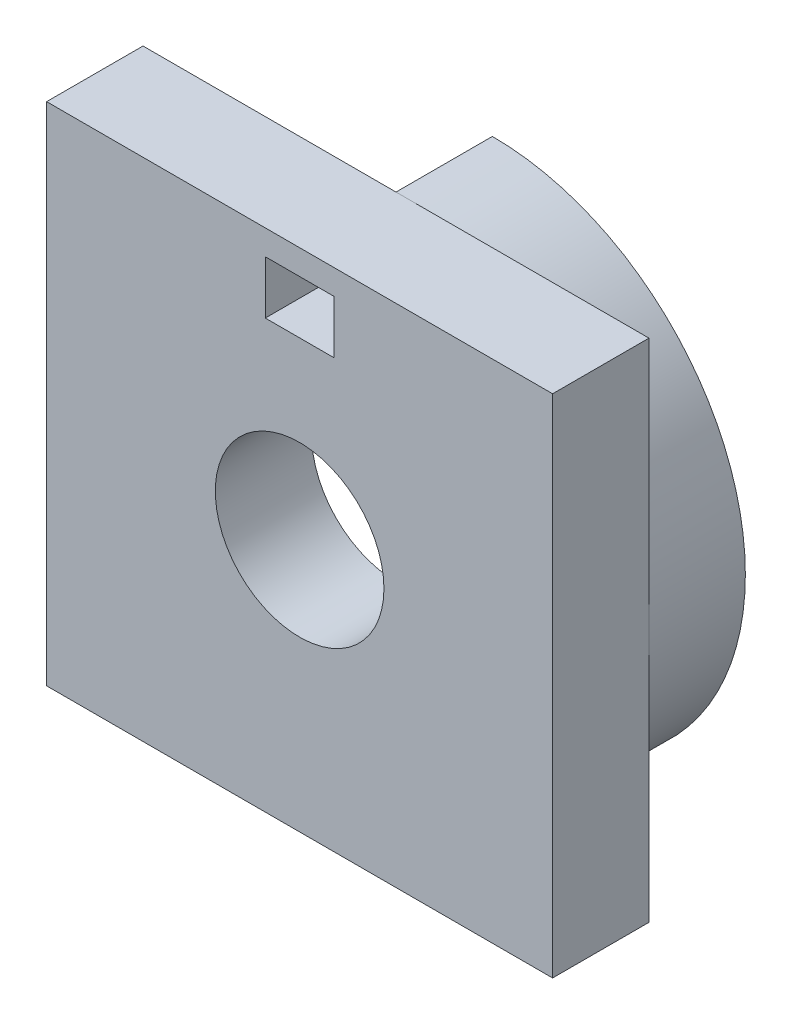
ISO-10303-21;
HEADER;
FILE_DESCRIPTION(('STEP AP214'),'2;1');
FILE_NAME('part.step','',(''),(''),'','','');
FILE_SCHEMA(('AUTOMOTIVE_DESIGN { 1 0 10303 214 1 1 1 1 }'));
ENDSEC;
DATA;
#1=APPLICATION_CONTEXT('core data for automotive mechanical design processes');
#2=APPLICATION_PROTOCOL_DEFINITION('international standard','automotive_design',2000,#1);
#3=PRODUCT_CONTEXT('',#1,'mechanical');
#4=PRODUCT('Part','Part','',(#3));
#5=PRODUCT_RELATED_PRODUCT_CATEGORY('part','',(#4));
#6=PRODUCT_DEFINITION_FORMATION('','',#4);
#7=PRODUCT_DEFINITION_CONTEXT('part definition',#1,'design');
#8=PRODUCT_DEFINITION('design','',#6,#7);
#9=PRODUCT_DEFINITION_SHAPE('','',#8);
#10=(LENGTH_UNIT() NAMED_UNIT(*) SI_UNIT(.MILLI.,.METRE.));
#11=(NAMED_UNIT(*) PLANE_ANGLE_UNIT() SI_UNIT($,.RADIAN.));
#12=(NAMED_UNIT(*) SI_UNIT($,.STERADIAN.) SOLID_ANGLE_UNIT());
#13=UNCERTAINTY_MEASURE_WITH_UNIT(LENGTH_MEASURE(1.E-05),#10,'distance_accuracy_value','');
#14=(GEOMETRIC_REPRESENTATION_CONTEXT(3) GLOBAL_UNCERTAINTY_ASSIGNED_CONTEXT((#13)) GLOBAL_UNIT_ASSIGNED_CONTEXT((#10,
#11,#12)) REPRESENTATION_CONTEXT('',''));
#15=CARTESIAN_POINT('',(0.,0.,0.));
#16=DIRECTION('',(0.,0.,1.));
#17=DIRECTION('',(1.,0.,0.));
#18=AXIS2_PLACEMENT_3D('',#15,#16,#17);
#19=CARTESIAN_POINT('',(0.,0.,0.));
#20=DIRECTION('',(0.,0.,1.));
#21=DIRECTION('',(1.,0.,0.));
#22=AXIS2_PLACEMENT_3D('',#19,#20,#21);
#23=PLANE('',#22);
#24=CARTESIAN_POINT('',(0.,0.,0.));
#25=DIRECTION('',(0.,0.,1.));
#26=DIRECTION('',(1.,0.,0.));
#27=AXIS2_PLACEMENT_3D('',#24,#25,#26);
#28=CIRCLE('',#27,3.5);
#29=CARTESIAN_POINT('',(3.5,0.,0.));
#30=VERTEX_POINT('',#29);
#31=EDGE_CURVE('E242',#30,#30,#28,.T.);
#32=ORIENTED_EDGE('',*,*,#31,.T.);
#33=EDGE_LOOP('',(#32));
#34=FACE_BOUND('',#33,.T.);
#35=DIRECTION('',(-1.,0.,0.));
#36=VECTOR('',#35,1.);
#37=CARTESIAN_POINT('',(1.425,7.2584031040867,0.));
#38=LINE('',#37,#36);
#39=CARTESIAN_POINT('',(1.425,7.2584031040867,0.));
#40=VERTEX_POINT('',#39);
#41=CARTESIAN_POINT('',(-1.425,7.25840310408671,0.));
#42=VERTEX_POINT('',#41);
#43=EDGE_CURVE('E179',#40,#42,#38,.T.);
#44=ORIENTED_EDGE('',*,*,#43,.F.);
#45=DIRECTION('',(0.,-1.,0.));
#46=VECTOR('',#45,1.);
#47=CARTESIAN_POINT('',(1.42499999999999,9.46381623713399,0.));
#48=LINE('',#47,#46);
#49=CARTESIAN_POINT('',(1.425,8.88647145947141,0.));
#50=VERTEX_POINT('',#49);
#51=EDGE_CURVE('E149',#50,#40,#48,.T.);
#52=ORIENTED_EDGE('',*,*,#51,.F.);
#53=CARTESIAN_POINT('',(0.,0.,0.));
#54=DIRECTION('',(0.,0.,1.));
#55=DIRECTION('',(-1.,0.,0.));
#56=AXIS2_PLACEMENT_3D('',#53,#54,#55);
#57=CIRCLE('',#56,9.);
#58=CARTESIAN_POINT('',(0.,-9.,0.));
#59=VERTEX_POINT('',#58);
#60=EDGE_CURVE('E198',#59,#50,#57,.T.);
#61=ORIENTED_EDGE('',*,*,#60,.F.);
#62=DIRECTION('',(0.,1.,0.));
#63=VECTOR('',#62,1.);
#64=CARTESIAN_POINT('',(0.,-9.,0.));
#65=LINE('',#64,#63);
#66=CARTESIAN_POINT('',(0.,-10.5,0.));
#67=VERTEX_POINT('',#66);
#68=EDGE_CURVE('E204',#67,#59,#65,.T.);
#69=ORIENTED_EDGE('',*,*,#68,.F.);
#70=DIRECTION('',(1.,0.,0.));
#71=VECTOR('',#70,1.);
#72=CARTESIAN_POINT('',(-10.5,-10.5,0.));
#73=LINE('',#72,#71);
#74=CARTESIAN_POINT('',(-10.5,-10.5,0.));
#75=VERTEX_POINT('',#74);
#76=EDGE_CURVE('E256',#75,#67,#73,.T.);
#77=ORIENTED_EDGE('',*,*,#76,.F.);
#78=DIRECTION('',(0.,-1.,0.));
#79=VECTOR('',#78,1.);
#80=CARTESIAN_POINT('',(-10.5,10.5,0.));
#81=LINE('',#80,#79);
#82=CARTESIAN_POINT('',(-10.5,10.5,0.));
#83=VERTEX_POINT('',#82);
#84=EDGE_CURVE('E275',#83,#75,#81,.T.);
#85=ORIENTED_EDGE('',*,*,#84,.F.);
#86=DIRECTION('',(-1.,0.,0.));
#87=VECTOR('',#86,1.);
#88=CARTESIAN_POINT('',(-10.5,10.5,0.));
#89=LINE('',#88,#87);
#90=CARTESIAN_POINT('',(0.,10.5,0.));
#91=VERTEX_POINT('',#90);
#92=EDGE_CURVE('E270',#91,#83,#89,.T.);
#93=ORIENTED_EDGE('',*,*,#92,.F.);
#94=DIRECTION('',(0.,1.,0.));
#95=VECTOR('',#94,1.);
#96=CARTESIAN_POINT('',(0.,10.5,0.));
#97=LINE('',#96,#95);
#98=CARTESIAN_POINT('',(0.,9.46381623713399,0.));
#99=VERTEX_POINT('',#98);
#100=EDGE_CURVE('E217',#99,#91,#97,.T.);
#101=ORIENTED_EDGE('',*,*,#100,.F.);
#102=DIRECTION('',(1.,0.,0.));
#103=VECTOR('',#102,1.);
#104=CARTESIAN_POINT('',(1.42499999999999,9.46381623713399,0.));
#105=LINE('',#104,#103);
#106=CARTESIAN_POINT('',(-1.42500000000001,9.46381623713399,0.));
#107=VERTEX_POINT('',#106);
#108=EDGE_CURVE('E65',#107,#99,#105,.T.);
#109=ORIENTED_EDGE('',*,*,#108,.F.);
#110=DIRECTION('',(0.,1.,0.));
#111=VECTOR('',#110,1.);
#112=CARTESIAN_POINT('',(-1.42500000000001,9.46381623713399,0.));
#113=LINE('',#112,#111);
#114=EDGE_CURVE('E182',#42,#107,#113,.T.);
#115=ORIENTED_EDGE('',*,*,#114,.F.);
#116=EDGE_LOOP('',(#44,#52,#61,#69,#77,#85,#93,#101,#109,#115));
#117=FACE_BOUND('',#116,.T.);
#118=ADVANCED_FACE('F39',(#34,#117),#23,.F.);
#119=CARTESIAN_POINT('',(0.,0.,0.));
#120=DIRECTION('',(0.,0.,-1.));
#121=DIRECTION('',(-1.,0.,0.));
#122=AXIS2_PLACEMENT_3D('',#119,#120,#121);
#123=CIRCLE('',#122,10.5);
#124=CARTESIAN_POINT('',(10.5,0.,0.));
#125=VERTEX_POINT('',#124);
#126=EDGE_CURVE('E11',#125,#67,#123,.T.);
#127=ORIENTED_EDGE('',*,*,#126,.F.);
#128=DIRECTION('',(0.,1.,0.));
#129=VECTOR('',#128,1.);
#130=CARTESIAN_POINT('',(10.5,10.5,0.));
#131=LINE('',#130,#129);
#132=CARTESIAN_POINT('',(10.5,-10.5,0.));
#133=VERTEX_POINT('',#132);
#134=EDGE_CURVE('E266',#133,#125,#131,.T.);
#135=ORIENTED_EDGE('',*,*,#134,.F.);
#136=EDGE_CURVE('E278',#67,#133,#73,.T.);
#137=ORIENTED_EDGE('',*,*,#136,.F.);
#138=EDGE_LOOP('',(#127,#135,#137));
#139=FACE_BOUND('',#138,.T.);
#140=ADVANCED_FACE('F329',(#139),#23,.F.);
#141=EDGE_CURVE('E50',#91,#125,#123,.T.);
#142=ORIENTED_EDGE('',*,*,#141,.F.);
#143=CARTESIAN_POINT('',(10.5,10.5,0.));
#144=VERTEX_POINT('',#143);
#145=EDGE_CURVE('E271',#144,#91,#89,.T.);
#146=ORIENTED_EDGE('',*,*,#145,.F.);
#147=EDGE_CURVE('E247',#125,#144,#131,.T.);
#148=ORIENTED_EDGE('',*,*,#147,.F.);
#149=EDGE_LOOP('',(#142,#146,#148));
#150=FACE_BOUND('',#149,.T.);
#151=ADVANCED_FACE('F309',(#150),#23,.F.);
#152=CARTESIAN_POINT('',(0.,0.,4.));
#153=DIRECTION('',(0.,0.,1.));
#154=DIRECTION('',(1.,0.,0.));
#155=AXIS2_PLACEMENT_3D('',#152,#153,#154);
#156=PLANE('',#155);
#157=DIRECTION('',(0.,-1.,0.));
#158=VECTOR('',#157,1.);
#159=CARTESIAN_POINT('',(1.42499999999999,9.46381623713399,4.));
#160=LINE('',#159,#158);
#161=CARTESIAN_POINT('',(1.42499999999999,9.46381623713399,4.));
#162=VERTEX_POINT('',#161);
#163=CARTESIAN_POINT('',(1.425,7.2584031040867,4.));
#164=VERTEX_POINT('',#163);
#165=EDGE_CURVE('E146',#162,#164,#160,.T.);
#166=ORIENTED_EDGE('',*,*,#165,.T.);
#167=DIRECTION('',(-1.,0.,0.));
#168=VECTOR('',#167,1.);
#169=CARTESIAN_POINT('',(1.425,7.2584031040867,4.));
#170=LINE('',#169,#168);
#171=CARTESIAN_POINT('',(-1.425,7.25840310408671,4.));
#172=VERTEX_POINT('',#171);
#173=EDGE_CURVE('E158',#164,#172,#170,.T.);
#174=ORIENTED_EDGE('',*,*,#173,.T.);
#175=DIRECTION('',(0.,1.,0.));
#176=VECTOR('',#175,1.);
#177=CARTESIAN_POINT('',(-1.42500000000001,9.46381623713399,4.));
#178=LINE('',#177,#176);
#179=CARTESIAN_POINT('',(-1.42500000000001,9.46381623713399,4.));
#180=VERTEX_POINT('',#179);
#181=EDGE_CURVE('E57',#172,#180,#178,.T.);
#182=ORIENTED_EDGE('',*,*,#181,.T.);
#183=DIRECTION('',(1.,0.,0.));
#184=VECTOR('',#183,1.);
#185=CARTESIAN_POINT('',(1.42499999999999,9.46381623713399,4.));
#186=LINE('',#185,#184);
#187=EDGE_CURVE('E155',#180,#162,#186,.T.);
#188=ORIENTED_EDGE('',*,*,#187,.T.);
#189=EDGE_LOOP('',(#166,#174,#182,#188));
#190=FACE_BOUND('',#189,.T.);
#191=DIRECTION('',(0.,1.,0.));
#192=VECTOR('',#191,1.);
#193=CARTESIAN_POINT('',(10.5,10.5,4.));
#194=LINE('',#193,#192);
#195=CARTESIAN_POINT('',(10.5,-10.5,4.));
#196=VERTEX_POINT('',#195);
#197=CARTESIAN_POINT('',(10.5,10.5,4.));
#198=VERTEX_POINT('',#197);
#199=EDGE_CURVE('E251',#196,#198,#194,.T.);
#200=ORIENTED_EDGE('',*,*,#199,.T.);
#201=DIRECTION('',(-1.,0.,0.));
#202=VECTOR('',#201,1.);
#203=CARTESIAN_POINT('',(-10.5,10.5,4.));
#204=LINE('',#203,#202);
#205=CARTESIAN_POINT('',(-10.5,10.5,4.));
#206=VERTEX_POINT('',#205);
#207=EDGE_CURVE('E255',#198,#206,#204,.T.);
#208=ORIENTED_EDGE('',*,*,#207,.T.);
#209=DIRECTION('',(0.,-1.,0.));
#210=VECTOR('',#209,1.);
#211=CARTESIAN_POINT('',(-10.5,10.5,4.));
#212=LINE('',#211,#210);
#213=CARTESIAN_POINT('',(-10.5,-10.5,4.));
#214=VERTEX_POINT('',#213);
#215=EDGE_CURVE('E259',#206,#214,#212,.T.);
#216=ORIENTED_EDGE('',*,*,#215,.T.);
#217=DIRECTION('',(1.,0.,0.));
#218=VECTOR('',#217,1.);
#219=CARTESIAN_POINT('',(-10.5,-10.5,4.));
#220=LINE('',#219,#218);
#221=EDGE_CURVE('E262',#214,#196,#220,.T.);
#222=ORIENTED_EDGE('',*,*,#221,.T.);
#223=EDGE_LOOP('',(#200,#208,#216,#222));
#224=FACE_BOUND('',#223,.T.);
#225=CARTESIAN_POINT('',(0.,0.,4.));
#226=DIRECTION('',(0.,0.,1.));
#227=DIRECTION('',(1.,0.,0.));
#228=AXIS2_PLACEMENT_3D('',#225,#226,#227);
#229=CIRCLE('',#228,3.5);
#230=CARTESIAN_POINT('',(3.5,0.,4.));
#231=VERTEX_POINT('',#230);
#232=EDGE_CURVE('E243',#231,#231,#229,.T.);
#233=ORIENTED_EDGE('',*,*,#232,.F.);
#234=EDGE_LOOP('',(#233));
#235=FACE_BOUND('',#234,.T.);
#236=ADVANCED_FACE('F163',(#190,#224,#235),#156,.T.);
#237=CARTESIAN_POINT('',(10.5,10.5,4.));
#238=DIRECTION('',(-1.,0.,0.));
#239=DIRECTION('',(0.,0.,1.));
#240=AXIS2_PLACEMENT_3D('',#237,#238,#239);
#241=PLANE('',#240);
#242=ORIENTED_EDGE('',*,*,#134,.T.);
#243=ORIENTED_EDGE('',*,*,#147,.T.);
#244=DIRECTION('',(0.,0.,-1.));
#245=VECTOR('',#244,1.);
#246=CARTESIAN_POINT('',(10.5,10.5,4.));
#247=LINE('',#246,#245);
#248=EDGE_CURVE('E43',#198,#144,#247,.T.);
#249=ORIENTED_EDGE('',*,*,#248,.F.);
#250=ORIENTED_EDGE('',*,*,#199,.F.);
#251=DIRECTION('',(0.,0.,-1.));
#252=VECTOR('',#251,1.);
#253=CARTESIAN_POINT('',(10.5,-10.5,4.));
#254=LINE('',#253,#252);
#255=EDGE_CURVE('E265',#196,#133,#254,.T.);
#256=ORIENTED_EDGE('',*,*,#255,.T.);
#257=EDGE_LOOP('',(#242,#243,#249,#250,#256));
#258=FACE_BOUND('',#257,.T.);
#259=ADVANCED_FACE('F41',(#258),#241,.F.);
#260=CARTESIAN_POINT('',(-10.5,10.5,4.));
#261=DIRECTION('',(0.,-1.,0.));
#262=DIRECTION('',(0.,0.,-1.));
#263=AXIS2_PLACEMENT_3D('',#260,#261,#262);
#264=PLANE('',#263);
#265=ORIENTED_EDGE('',*,*,#145,.T.);
#266=ORIENTED_EDGE('',*,*,#92,.T.);
#267=DIRECTION('',(0.,0.,-1.));
#268=VECTOR('',#267,1.);
#269=CARTESIAN_POINT('',(-10.5,10.5,4.));
#270=LINE('',#269,#268);
#271=EDGE_CURVE('E288',#206,#83,#270,.T.);
#272=ORIENTED_EDGE('',*,*,#271,.F.);
#273=ORIENTED_EDGE('',*,*,#207,.F.);
#274=ORIENTED_EDGE('',*,*,#248,.T.);
#275=EDGE_LOOP('',(#265,#266,#272,#273,#274));
#276=FACE_BOUND('',#275,.T.);
#277=ADVANCED_FACE('F299',(#276),#264,.F.);
#278=CARTESIAN_POINT('',(-10.5,10.5,4.));
#279=DIRECTION('',(1.,0.,0.));
#280=DIRECTION('',(0.,0.,-1.));
#281=AXIS2_PLACEMENT_3D('',#278,#279,#280);
#282=PLANE('',#281);
#283=ORIENTED_EDGE('',*,*,#84,.T.);
#284=DIRECTION('',(0.,0.,-1.));
#285=VECTOR('',#284,1.);
#286=CARTESIAN_POINT('',(-10.5,-10.5,4.));
#287=LINE('',#286,#285);
#288=EDGE_CURVE('E285',#214,#75,#287,.T.);
#289=ORIENTED_EDGE('',*,*,#288,.F.);
#290=ORIENTED_EDGE('',*,*,#215,.F.);
#291=ORIENTED_EDGE('',*,*,#271,.T.);
#292=EDGE_LOOP('',(#283,#289,#290,#291));
#293=FACE_BOUND('',#292,.T.);
#294=ADVANCED_FACE('F425',(#293),#282,.F.);
#295=CARTESIAN_POINT('',(-10.5,-10.5,4.));
#296=DIRECTION('',(0.,1.,0.));
#297=DIRECTION('',(0.,0.,1.));
#298=AXIS2_PLACEMENT_3D('',#295,#296,#297);
#299=PLANE('',#298);
#300=ORIENTED_EDGE('',*,*,#76,.T.);
#301=ORIENTED_EDGE('',*,*,#136,.T.);
#302=ORIENTED_EDGE('',*,*,#255,.F.);
#303=ORIENTED_EDGE('',*,*,#221,.F.);
#304=ORIENTED_EDGE('',*,*,#288,.T.);
#305=EDGE_LOOP('',(#300,#301,#302,#303,#304));
#306=FACE_BOUND('',#305,.T.);
#307=ADVANCED_FACE('F325',(#306),#299,.F.);
#308=CARTESIAN_POINT('',(0.,0.,4.));
#309=DIRECTION('',(0.,0.,-1.));
#310=DIRECTION('',(-1.,0.,0.));
#311=AXIS2_PLACEMENT_3D('',#308,#309,#310);
#312=CYLINDRICAL_SURFACE('',#311,3.5);
#313=ORIENTED_EDGE('',*,*,#232,.T.);
#314=EDGE_LOOP('',(#313));
#315=FACE_BOUND('',#314,.T.);
#316=ORIENTED_EDGE('',*,*,#31,.F.);
#317=EDGE_LOOP('',(#316));
#318=FACE_BOUND('',#317,.T.);
#319=ADVANCED_FACE('F372',(#315,#318),#312,.F.);
#320=CARTESIAN_POINT('',(0.,0.,-4.));
#321=DIRECTION('',(0.,0.,1.));
#322=DIRECTION('',(1.,0.,0.));
#323=AXIS2_PLACEMENT_3D('',#320,#321,#322);
#324=CYLINDRICAL_SURFACE('',#323,9.);
#325=ORIENTED_EDGE('',*,*,#60,.T.);
#326=CARTESIAN_POINT('',(0.,0.,0.));
#327=DIRECTION('',(0.,0.,-1.));
#328=DIRECTION('',(-1.,0.,0.));
#329=AXIS2_PLACEMENT_3D('',#326,#327,#328);
#330=CIRCLE('',#329,9.);
#331=CARTESIAN_POINT('',(0.,9.,0.));
#332=VERTEX_POINT('',#331);
#333=EDGE_CURVE('E189',#50,#332,#330,.F.);
#334=ORIENTED_EDGE('',*,*,#333,.T.);
#335=DIRECTION('',(0.,0.,1.));
#336=VECTOR('',#335,1.);
#337=CARTESIAN_POINT('',(0.,9.,-4.));
#338=LINE('',#337,#336);
#339=CARTESIAN_POINT('',(0.,9.,-4.));
#340=VERTEX_POINT('',#339);
#341=EDGE_CURVE('E238',#340,#332,#338,.T.);
#342=ORIENTED_EDGE('',*,*,#341,.F.);
#343=CARTESIAN_POINT('',(0.,0.,-4.));
#344=DIRECTION('',(0.,0.,1.));
#345=DIRECTION('',(-1.,0.,0.));
#346=AXIS2_PLACEMENT_3D('',#343,#344,#345);
#347=CIRCLE('',#346,9.);
#348=CARTESIAN_POINT('',(0.,-9.,-4.));
#349=VERTEX_POINT('',#348);
#350=EDGE_CURVE('E199',#349,#340,#347,.T.);
#351=ORIENTED_EDGE('',*,*,#350,.F.);
#352=DIRECTION('',(0.,0.,1.));
#353=VECTOR('',#352,1.);
#354=CARTESIAN_POINT('',(0.,-9.,-4.));
#355=LINE('',#354,#353);
#356=EDGE_CURVE('E213',#349,#59,#355,.T.);
#357=ORIENTED_EDGE('',*,*,#356,.T.);
#358=EDGE_LOOP('',(#325,#334,#342,#351,#357));
#359=FACE_BOUND('',#358,.T.);
#360=ADVANCED_FACE('F339',(#359),#324,.F.);
#361=CARTESIAN_POINT('',(0.,10.5,-4.));
#362=DIRECTION('',(1.,0.,0.));
#363=DIRECTION('',(0.,0.,-1.));
#364=AXIS2_PLACEMENT_3D('',#361,#362,#363);
#365=PLANE('',#364);
#366=EDGE_CURVE('E218',#332,#99,#97,.T.);
#367=ORIENTED_EDGE('',*,*,#366,.T.);
#368=ORIENTED_EDGE('',*,*,#100,.T.);
#369=DIRECTION('',(0.,0.,1.));
#370=VECTOR('',#369,1.);
#371=CARTESIAN_POINT('',(0.,10.5,-4.));
#372=LINE('',#371,#370);
#373=CARTESIAN_POINT('',(0.,10.5,-4.));
#374=VERTEX_POINT('',#373);
#375=EDGE_CURVE('E234',#374,#91,#372,.T.);
#376=ORIENTED_EDGE('',*,*,#375,.F.);
#377=DIRECTION('',(0.,1.,0.));
#378=VECTOR('',#377,1.);
#379=CARTESIAN_POINT('',(0.,10.5,-4.));
#380=LINE('',#379,#378);
#381=EDGE_CURVE('E203',#340,#374,#380,.T.);
#382=ORIENTED_EDGE('',*,*,#381,.F.);
#383=ORIENTED_EDGE('',*,*,#341,.T.);
#384=EDGE_LOOP('',(#367,#368,#376,#382,#383));
#385=FACE_BOUND('',#384,.T.);
#386=ADVANCED_FACE('F316',(#385),#365,.F.);
#387=CARTESIAN_POINT('',(0.,0.,-4.));
#388=DIRECTION('',(0.,0.,1.));
#389=DIRECTION('',(1.,0.,0.));
#390=AXIS2_PLACEMENT_3D('',#387,#388,#389);
#391=CYLINDRICAL_SURFACE('',#390,10.5);
#392=ORIENTED_EDGE('',*,*,#141,.T.);
#393=ORIENTED_EDGE('',*,*,#126,.T.);
#394=DIRECTION('',(0.,0.,1.));
#395=VECTOR('',#394,1.);
#396=CARTESIAN_POINT('',(0.,-10.5,-4.));
#397=LINE('',#396,#395);
#398=CARTESIAN_POINT('',(0.,-10.5,-4.));
#399=VERTEX_POINT('',#398);
#400=EDGE_CURVE('E230',#399,#67,#397,.T.);
#401=ORIENTED_EDGE('',*,*,#400,.F.);
#402=CARTESIAN_POINT('',(0.,0.,-4.));
#403=DIRECTION('',(0.,0.,-1.));
#404=DIRECTION('',(-1.,0.,0.));
#405=AXIS2_PLACEMENT_3D('',#402,#403,#404);
#406=CIRCLE('',#405,10.5);
#407=EDGE_CURVE('E207',#374,#399,#406,.T.);
#408=ORIENTED_EDGE('',*,*,#407,.F.);
#409=ORIENTED_EDGE('',*,*,#375,.T.);
#410=EDGE_LOOP('',(#392,#393,#401,#408,#409));
#411=FACE_BOUND('',#410,.T.);
#412=ADVANCED_FACE('F313',(#411),#391,.T.);
#413=CARTESIAN_POINT('',(0.,-9.,-4.));
#414=DIRECTION('',(1.,0.,0.));
#415=DIRECTION('',(0.,0.,-1.));
#416=AXIS2_PLACEMENT_3D('',#413,#414,#415);
#417=PLANE('',#416);
#418=ORIENTED_EDGE('',*,*,#68,.T.);
#419=ORIENTED_EDGE('',*,*,#356,.F.);
#420=DIRECTION('',(0.,1.,0.));
#421=VECTOR('',#420,1.);
#422=CARTESIAN_POINT('',(0.,-9.,-4.));
#423=LINE('',#422,#421);
#424=EDGE_CURVE('E210',#399,#349,#423,.T.);
#425=ORIENTED_EDGE('',*,*,#424,.F.);
#426=ORIENTED_EDGE('',*,*,#400,.T.);
#427=EDGE_LOOP('',(#418,#419,#425,#426));
#428=FACE_BOUND('',#427,.T.);
#429=ADVANCED_FACE('F332',(#428),#417,.F.);
#430=CARTESIAN_POINT('',(0.,0.,-4.));
#431=DIRECTION('',(0.,0.,-1.));
#432=DIRECTION('',(-1.,0.,0.));
#433=AXIS2_PLACEMENT_3D('',#430,#431,#432);
#434=PLANE('',#433);
#435=ORIENTED_EDGE('',*,*,#350,.T.);
#436=ORIENTED_EDGE('',*,*,#381,.T.);
#437=ORIENTED_EDGE('',*,*,#407,.T.);
#438=ORIENTED_EDGE('',*,*,#424,.T.);
#439=EDGE_LOOP('',(#435,#436,#437,#438));
#440=FACE_BOUND('',#439,.T.);
#441=ADVANCED_FACE('F336',(#440),#434,.T.);
#442=CARTESIAN_POINT('',(0.,0.,0.));
#443=DIRECTION('',(0.,0.,-1.));
#444=DIRECTION('',(-1.,0.,0.));
#445=AXIS2_PLACEMENT_3D('',#442,#443,#444);
#446=PLANE('',#445);
#447=CARTESIAN_POINT('',(1.42499999999999,9.46381623713399,0.));
#448=VERTEX_POINT('',#447);
#449=EDGE_CURVE('E176',#448,#50,#48,.T.);
#450=ORIENTED_EDGE('',*,*,#449,.F.);
#451=EDGE_CURVE('E169',#99,#448,#105,.T.);
#452=ORIENTED_EDGE('',*,*,#451,.F.);
#453=ORIENTED_EDGE('',*,*,#366,.F.);
#454=ORIENTED_EDGE('',*,*,#333,.F.);
#455=EDGE_LOOP('',(#450,#452,#453,#454));
#456=FACE_BOUND('',#455,.T.);
#457=ADVANCED_FACE('F342',(#456),#446,.F.);
#458=CARTESIAN_POINT('',(1.42499999999999,9.46381623713399,4.));
#459=DIRECTION('',(1.,0.,0.));
#460=DIRECTION('',(0.,1.,0.));
#461=AXIS2_PLACEMENT_3D('',#458,#459,#460);
#462=PLANE('',#461);
#463=ORIENTED_EDGE('',*,*,#449,.T.);
#464=ORIENTED_EDGE('',*,*,#51,.T.);
#465=DIRECTION('',(0.,0.,-1.));
#466=VECTOR('',#465,1.);
#467=CARTESIAN_POINT('',(1.425,7.2584031040867,4.));
#468=LINE('',#467,#466);
#469=EDGE_CURVE('E140',#164,#40,#468,.T.);
#470=ORIENTED_EDGE('',*,*,#469,.F.);
#471=ORIENTED_EDGE('',*,*,#165,.F.);
#472=DIRECTION('',(0.,0.,-1.));
#473=VECTOR('',#472,1.);
#474=CARTESIAN_POINT('',(1.42499999999999,9.46381623713399,4.));
#475=LINE('',#474,#473);
#476=EDGE_CURVE('E186',#162,#448,#475,.T.);
#477=ORIENTED_EDGE('',*,*,#476,.T.);
#478=EDGE_LOOP('',(#463,#464,#470,#471,#477));
#479=FACE_BOUND('',#478,.T.);
#480=ADVANCED_FACE('F143',(#479),#462,.F.);
#481=CARTESIAN_POINT('',(1.42499999999999,9.46381623713399,4.));
#482=DIRECTION('',(0.,1.,0.));
#483=DIRECTION('',(0.,0.,1.));
#484=AXIS2_PLACEMENT_3D('',#481,#482,#483);
#485=PLANE('',#484);
#486=ORIENTED_EDGE('',*,*,#108,.T.);
#487=ORIENTED_EDGE('',*,*,#451,.T.);
#488=ORIENTED_EDGE('',*,*,#476,.F.);
#489=ORIENTED_EDGE('',*,*,#187,.F.);
#490=DIRECTION('',(0.,0.,-1.));
#491=VECTOR('',#490,1.);
#492=CARTESIAN_POINT('',(-1.42500000000001,9.46381623713399,4.));
#493=LINE('',#492,#491);
#494=EDGE_CURVE('E190',#180,#107,#493,.T.);
#495=ORIENTED_EDGE('',*,*,#494,.T.);
#496=EDGE_LOOP('',(#486,#487,#488,#489,#495));
#497=FACE_BOUND('',#496,.T.);
#498=ADVANCED_FACE('F346',(#497),#485,.F.);
#499=CARTESIAN_POINT('',(-1.42500000000001,9.46381623713399,4.));
#500=DIRECTION('',(-1.,0.,0.));
#501=DIRECTION('',(0.,-1.,0.));
#502=AXIS2_PLACEMENT_3D('',#499,#500,#501);
#503=PLANE('',#502);
#504=ORIENTED_EDGE('',*,*,#114,.T.);
#505=ORIENTED_EDGE('',*,*,#494,.F.);
#506=ORIENTED_EDGE('',*,*,#181,.F.);
#507=DIRECTION('',(0.,0.,-1.));
#508=VECTOR('',#507,1.);
#509=CARTESIAN_POINT('',(-1.425,7.25840310408671,4.));
#510=LINE('',#509,#508);
#511=EDGE_CURVE('E154',#172,#42,#510,.T.);
#512=ORIENTED_EDGE('',*,*,#511,.T.);
#513=EDGE_LOOP('',(#504,#505,#506,#512));
#514=FACE_BOUND('',#513,.T.);
#515=ADVANCED_FACE('F347',(#514),#503,.F.);
#516=CARTESIAN_POINT('',(1.425,7.2584031040867,4.));
#517=DIRECTION('',(0.,-1.,0.));
#518=DIRECTION('',(1.,0.,0.));
#519=AXIS2_PLACEMENT_3D('',#516,#517,#518);
#520=PLANE('',#519);
#521=ORIENTED_EDGE('',*,*,#43,.T.);
#522=ORIENTED_EDGE('',*,*,#511,.F.);
#523=ORIENTED_EDGE('',*,*,#173,.F.);
#524=ORIENTED_EDGE('',*,*,#469,.T.);
#525=EDGE_LOOP('',(#521,#522,#523,#524));
#526=FACE_BOUND('',#525,.T.);
#527=ADVANCED_FACE('F159',(#526),#520,.F.);
#528=CLOSED_SHELL('',(#118,#140,#151,#236,#259,#277,#294,#307,#319,#360,#386,#412,#429,#441,
#457,#480,#498,#515,#527));
#529=MANIFOLD_SOLID_BREP('B2',#528);
#530=ADVANCED_BREP_SHAPE_REPRESENTATION('',(#18,#529),#14);
#531=SHAPE_DEFINITION_REPRESENTATION(#9,#530);
ENDSEC;
END-ISO-10303-21;
